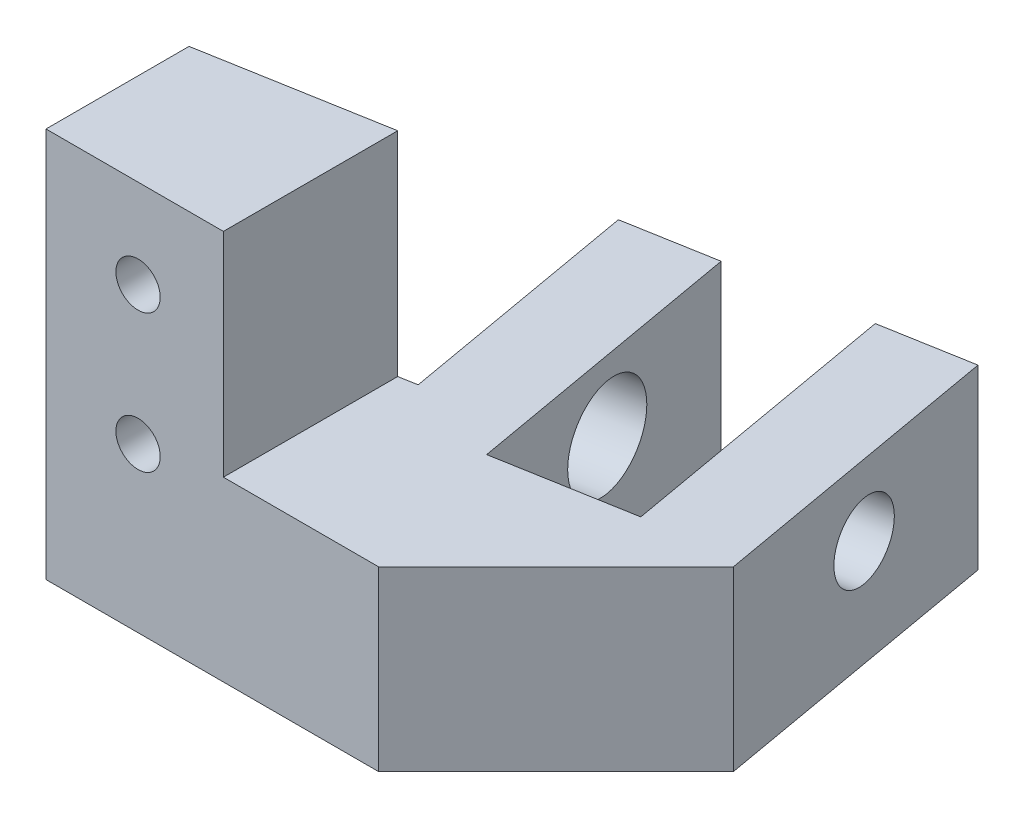
ISO-10303-21;
HEADER;
FILE_DESCRIPTION(('STEP AP214'),'2;1');
FILE_NAME('part.step','',(''),(''),'','','');
FILE_SCHEMA(('AUTOMOTIVE_DESIGN { 1 0 10303 214 1 1 1 1 }'));
ENDSEC;
DATA;
#1=APPLICATION_CONTEXT('core data for automotive mechanical design processes');
#2=APPLICATION_PROTOCOL_DEFINITION('international standard','automotive_design',2000,#1);
#3=PRODUCT_CONTEXT('',#1,'mechanical');
#4=PRODUCT('Part','Part','',(#3));
#5=PRODUCT_RELATED_PRODUCT_CATEGORY('part','',(#4));
#6=PRODUCT_DEFINITION_FORMATION('','',#4);
#7=PRODUCT_DEFINITION_CONTEXT('part definition',#1,'design');
#8=PRODUCT_DEFINITION('design','',#6,#7);
#9=PRODUCT_DEFINITION_SHAPE('','',#8);
#10=(LENGTH_UNIT() NAMED_UNIT(*) SI_UNIT(.MILLI.,.METRE.));
#11=(NAMED_UNIT(*) PLANE_ANGLE_UNIT() SI_UNIT($,.RADIAN.));
#12=(NAMED_UNIT(*) SI_UNIT($,.STERADIAN.) SOLID_ANGLE_UNIT());
#13=UNCERTAINTY_MEASURE_WITH_UNIT(LENGTH_MEASURE(1.E-05),#10,'distance_accuracy_value','');
#14=(GEOMETRIC_REPRESENTATION_CONTEXT(3) GLOBAL_UNCERTAINTY_ASSIGNED_CONTEXT((#13)) GLOBAL_UNIT_ASSIGNED_CONTEXT((#10,
#11,#12)) REPRESENTATION_CONTEXT('',''));
#15=CARTESIAN_POINT('',(0.,0.,0.));
#16=DIRECTION('',(0.,0.,1.));
#17=DIRECTION('',(1.,0.,0.));
#18=AXIS2_PLACEMENT_3D('',#15,#16,#17);
#19=CARTESIAN_POINT('',(0.,22.,10.));
#20=DIRECTION('',(1.,0.,0.));
#21=DIRECTION('',(0.,0.,-1.));
#22=AXIS2_PLACEMENT_3D('',#19,#20,#21);
#23=PLANE('',#22);
#24=DIRECTION('',(0.,0.,-1.));
#25=VECTOR('',#24,1.);
#26=CARTESIAN_POINT('',(0.,22.,10.));
#27=LINE('',#26,#25);
#28=CARTESIAN_POINT('',(0.,22.,10.));
#29=VERTEX_POINT('',#28);
#30=CARTESIAN_POINT('',(0.,22.,1.93607629478369));
#31=VERTEX_POINT('',#30);
#32=EDGE_CURVE('E154',#29,#31,#27,.T.);
#33=ORIENTED_EDGE('',*,*,#32,.T.);
#34=DIRECTION('',(0.,1.,0.));
#35=VECTOR('',#34,1.);
#36=CARTESIAN_POINT('',(0.,-0.00100000000001141,1.93607629478369));
#37=LINE('',#36,#35);
#38=CARTESIAN_POINT('',(0.,0.,1.93607629478369));
#39=VERTEX_POINT('',#38);
#40=EDGE_CURVE('E135',#39,#31,#37,.T.);
#41=ORIENTED_EDGE('',*,*,#40,.F.);
#42=DIRECTION('',(0.,0.,-1.));
#43=VECTOR('',#42,1.);
#44=CARTESIAN_POINT('',(0.,0.,10.));
#45=LINE('',#44,#43);
#46=CARTESIAN_POINT('',(0.,0.,10.));
#47=VERTEX_POINT('',#46);
#48=EDGE_CURVE('E156',#47,#39,#45,.T.);
#49=ORIENTED_EDGE('',*,*,#48,.F.);
#50=DIRECTION('',(0.,-1.,0.));
#51=VECTOR('',#50,1.);
#52=CARTESIAN_POINT('',(0.,22.,10.));
#53=LINE('',#52,#51);
#54=EDGE_CURVE('E184',#29,#47,#53,.T.);
#55=ORIENTED_EDGE('',*,*,#54,.F.);
#56=EDGE_LOOP('',(#33,#41,#49,#55));
#57=FACE_BOUND('',#56,.T.);
#58=ADVANCED_FACE('F36',(#57),#23,.F.);
#59=CARTESIAN_POINT('',(0.,0.,10.));
#60=DIRECTION('',(0.,1.,0.));
#61=DIRECTION('',(0.,0.,1.));
#62=AXIS2_PLACEMENT_3D('',#59,#60,#61);
#63=PLANE('',#62);
#64=ORIENTED_EDGE('',*,*,#48,.T.);
#65=DIRECTION('',(-0.984807753012208,0.,0.173648177666931));
#66=VECTOR('',#65,1.);
#67=CARTESIAN_POINT('',(10.9800342919995,0.,0.));
#68=LINE('',#67,#66);
#69=CARTESIAN_POINT('',(10.9800342919995,0.,0.));
#70=VERTEX_POINT('',#69);
#71=EDGE_CURVE('E248',#70,#39,#68,.T.);
#72=ORIENTED_EDGE('',*,*,#71,.F.);
#73=DIRECTION('',(-0.173648177666931,0.,-0.984807753012208));
#74=VECTOR('',#73,1.);
#75=CARTESIAN_POINT('',(8.56384530194855,0.,-13.7028886920363));
#76=LINE('',#75,#74);
#77=CARTESIAN_POINT('',(8.56384530194855,0.,-13.7028886920363));
#78=VERTEX_POINT('',#77);
#79=EDGE_CURVE('E207',#70,#78,#76,.T.);
#80=ORIENTED_EDGE('',*,*,#79,.T.);
#81=DIRECTION('',(0.984807753012208,0.,-0.173648177666931));
#82=VECTOR('',#81,1.);
#83=CARTESIAN_POINT('',(13.4878840670096,0.,-14.5711295803709));
#84=LINE('',#83,#82);
#85=CARTESIAN_POINT('',(13.4878840670096,0.,-14.5711295803709));
#86=VERTEX_POINT('',#85);
#87=EDGE_CURVE('E216',#78,#86,#84,.T.);
#88=ORIENTED_EDGE('',*,*,#87,.T.);
#89=DIRECTION('',(0.17364817766693,0.,0.984807753012208));
#90=VECTOR('',#89,1.);
#91=CARTESIAN_POINT('',(16.0571673514282,0.,0.));
#92=LINE('',#91,#90);
#93=CARTESIAN_POINT('',(16.3176396179286,0.,1.47721162951831));
#94=VERTEX_POINT('',#93);
#95=EDGE_CURVE('E182',#86,#94,#92,.T.);
#96=ORIENTED_EDGE('',*,*,#95,.T.);
#97=DIRECTION('',(-0.984807753012208,0.,0.173648177666931));
#98=VECTOR('',#97,1.);
#99=CARTESIAN_POINT('',(16.3176396179286,0.,1.47721162951831));
#100=LINE('',#99,#98);
#101=CARTESIAN_POINT('',(23.7036977655202,0.,0.174850297016331));
#102=VERTEX_POINT('',#101);
#103=EDGE_CURVE('E235',#102,#94,#100,.T.);
#104=ORIENTED_EDGE('',*,*,#103,.F.);
#105=DIRECTION('',(-0.173648177666931,0.,-0.984807753012208));
#106=VECTOR('',#105,1.);
#107=CARTESIAN_POINT('',(20.8739422146012,0.,-15.8734909128729));
#108=LINE('',#107,#106);
#109=CARTESIAN_POINT('',(20.8739422146011,0.,-15.8734909128729));
#110=VERTEX_POINT('',#109);
#111=EDGE_CURVE('E189',#102,#110,#108,.T.);
#112=ORIENTED_EDGE('',*,*,#111,.T.);
#113=DIRECTION('',(0.984807753012208,0.,-0.17364817766693));
#114=VECTOR('',#113,1.);
#115=CARTESIAN_POINT('',(25.7979809796622,0.,-16.7417318012075));
#116=LINE('',#115,#114);
#117=CARTESIAN_POINT('',(25.7979809796622,0.,-16.7417318012075));
#118=VERTEX_POINT('',#117);
#119=EDGE_CURVE('E201',#110,#118,#116,.T.);
#120=ORIENTED_EDGE('',*,*,#119,.T.);
#121=DIRECTION('',(0.17364817766693,0.,0.984807753012208));
#122=VECTOR('',#121,1.);
#123=CARTESIAN_POINT('',(28.75,0.,0.));
#124=LINE('',#123,#122);
#125=CARTESIAN_POINT('',(28.75,0.,0.));
#126=VERTEX_POINT('',#125);
#127=EDGE_CURVE('E185',#118,#126,#124,.T.);
#128=ORIENTED_EDGE('',*,*,#127,.T.);
#129=DIRECTION('',(-0.707106781186546,0.,0.707106781186549));
#130=VECTOR('',#129,1.);
#131=CARTESIAN_POINT('',(18.75,0.,10.));
#132=LINE('',#131,#130);
#133=CARTESIAN_POINT('',(18.75,0.,10.));
#134=VERTEX_POINT('',#133);
#135=EDGE_CURVE('E11',#126,#134,#132,.T.);
#136=ORIENTED_EDGE('',*,*,#135,.T.);
#137=DIRECTION('',(1.,0.,0.));
#138=VECTOR('',#137,1.);
#139=CARTESIAN_POINT('',(0.,0.,10.));
#140=LINE('',#139,#138);
#141=EDGE_CURVE('E187',#47,#134,#140,.T.);
#142=ORIENTED_EDGE('',*,*,#141,.F.);
#143=EDGE_LOOP('',(#64,#72,#80,#88,#96,#104,#112,#120,#128,#136,#142));
#144=FACE_BOUND('',#143,.T.);
#145=ADVANCED_FACE('F279',(#144),#63,.F.);
#146=CARTESIAN_POINT('',(28.75,10.,10.));
#147=DIRECTION('',(0.,-1.,0.));
#148=DIRECTION('',(1.,0.,0.));
#149=AXIS2_PLACEMENT_3D('',#146,#147,#148);
#150=PLANE('',#149);
#151=DIRECTION('',(0.173648177666931,0.,0.984807753012208));
#152=VECTOR('',#151,1.);
#153=CARTESIAN_POINT('',(8.56384530194855,10.,-13.7028886920363));
#154=LINE('',#153,#152);
#155=CARTESIAN_POINT('',(8.56384530194855,10.,-13.7028886920363));
#156=VERTEX_POINT('',#155);
#157=CARTESIAN_POINT('',(10.9800342919995,10.,0.));
#158=VERTEX_POINT('',#157);
#159=EDGE_CURVE('E211',#156,#158,#154,.T.);
#160=ORIENTED_EDGE('',*,*,#159,.T.);
#161=DIRECTION('',(0.984807753012208,0.,-0.173648177666931));
#162=VECTOR('',#161,1.);
#163=CARTESIAN_POINT('',(10.9800342919995,10.,0.));
#164=LINE('',#163,#162);
#165=CARTESIAN_POINT('',(10.,10.,0.172806487699028));
#166=VERTEX_POINT('',#165);
#167=EDGE_CURVE('E252',#166,#158,#164,.T.);
#168=ORIENTED_EDGE('',*,*,#167,.F.);
#169=DIRECTION('',(0.,0.,-1.));
#170=VECTOR('',#169,1.);
#171=CARTESIAN_POINT('',(10.,10.,10.));
#172=LINE('',#171,#170);
#173=CARTESIAN_POINT('',(10.,10.,10.));
#174=VERTEX_POINT('',#173);
#175=EDGE_CURVE('E149',#174,#166,#172,.T.);
#176=ORIENTED_EDGE('',*,*,#175,.F.);
#177=DIRECTION('',(-1.,0.,0.));
#178=VECTOR('',#177,1.);
#179=CARTESIAN_POINT('',(28.75,10.,10.));
#180=LINE('',#179,#178);
#181=CARTESIAN_POINT('',(18.75,10.,10.));
#182=VERTEX_POINT('',#181);
#183=EDGE_CURVE('E172',#182,#174,#180,.T.);
#184=ORIENTED_EDGE('',*,*,#183,.F.);
#185=DIRECTION('',(0.707106781186546,0.,-0.707106781186549));
#186=VECTOR('',#185,1.);
#187=CARTESIAN_POINT('',(18.75,10.,10.));
#188=LINE('',#187,#186);
#189=CARTESIAN_POINT('',(28.75,10.,0.));
#190=VERTEX_POINT('',#189);
#191=EDGE_CURVE('E45',#182,#190,#188,.T.);
#192=ORIENTED_EDGE('',*,*,#191,.T.);
#193=DIRECTION('',(-0.17364817766693,0.,-0.984807753012208));
#194=VECTOR('',#193,1.);
#195=CARTESIAN_POINT('',(28.75,10.,0.));
#196=LINE('',#195,#194);
#197=CARTESIAN_POINT('',(25.7979809796622,10.,-16.7417318012075));
#198=VERTEX_POINT('',#197);
#199=EDGE_CURVE('E171',#190,#198,#196,.T.);
#200=ORIENTED_EDGE('',*,*,#199,.T.);
#201=DIRECTION('',(-0.984807753012208,0.,0.17364817766693));
#202=VECTOR('',#201,1.);
#203=CARTESIAN_POINT('',(25.7979809796622,10.,-16.7417318012075));
#204=LINE('',#203,#202);
#205=CARTESIAN_POINT('',(20.8739422146011,10.,-15.8734909128729));
#206=VERTEX_POINT('',#205);
#207=EDGE_CURVE('E181',#198,#206,#204,.T.);
#208=ORIENTED_EDGE('',*,*,#207,.T.);
#209=DIRECTION('',(0.173648177666931,0.,0.984807753012208));
#210=VECTOR('',#209,1.);
#211=CARTESIAN_POINT('',(20.8739422146011,10.,-15.8734909128729));
#212=LINE('',#211,#210);
#213=CARTESIAN_POINT('',(23.7036977655202,10.,0.174850297016331));
#214=VERTEX_POINT('',#213);
#215=EDGE_CURVE('E199',#206,#214,#212,.T.);
#216=ORIENTED_EDGE('',*,*,#215,.T.);
#217=DIRECTION('',(0.984807753012208,0.,-0.173648177666931));
#218=VECTOR('',#217,1.);
#219=CARTESIAN_POINT('',(16.3176396179286,10.,1.47721162951831));
#220=LINE('',#219,#218);
#221=CARTESIAN_POINT('',(16.3176396179286,10.,1.47721162951831));
#222=VERTEX_POINT('',#221);
#223=EDGE_CURVE('E230',#222,#214,#220,.T.);
#224=ORIENTED_EDGE('',*,*,#223,.F.);
#225=DIRECTION('',(-0.17364817766693,0.,-0.984807753012208));
#226=VECTOR('',#225,1.);
#227=CARTESIAN_POINT('',(16.0571673514282,10.,0.));
#228=LINE('',#227,#226);
#229=CARTESIAN_POINT('',(13.4878840670096,10.,-14.5711295803709));
#230=VERTEX_POINT('',#229);
#231=EDGE_CURVE('E221',#222,#230,#228,.T.);
#232=ORIENTED_EDGE('',*,*,#231,.T.);
#233=DIRECTION('',(-0.984807753012208,0.,0.173648177666931));
#234=VECTOR('',#233,1.);
#235=CARTESIAN_POINT('',(13.4878840670096,10.,-14.5711295803709));
#236=LINE('',#235,#234);
#237=EDGE_CURVE('E218',#230,#156,#236,.T.);
#238=ORIENTED_EDGE('',*,*,#237,.T.);
#239=EDGE_LOOP('',(#160,#168,#176,#184,#192,#200,#208,#216,#224,#232,#238));
#240=FACE_BOUND('',#239,.T.);
#241=ADVANCED_FACE('F169',(#240),#150,.F.);
#242=CARTESIAN_POINT('',(10.,10.,10.));
#243=DIRECTION('',(-1.,0.,0.));
#244=DIRECTION('',(0.,0.,1.));
#245=AXIS2_PLACEMENT_3D('',#242,#243,#244);
#246=PLANE('',#245);
#247=ORIENTED_EDGE('',*,*,#175,.T.);
#248=DIRECTION('',(0.,-1.,0.));
#249=VECTOR('',#248,1.);
#250=CARTESIAN_POINT('',(10.,-0.00100000000000793,0.172806487699029));
#251=LINE('',#250,#249);
#252=CARTESIAN_POINT('',(10.,22.,0.172806487699028));
#253=VERTEX_POINT('',#252);
#254=EDGE_CURVE('E132',#253,#166,#251,.T.);
#255=ORIENTED_EDGE('',*,*,#254,.F.);
#256=DIRECTION('',(0.,0.,-1.));
#257=VECTOR('',#256,1.);
#258=CARTESIAN_POINT('',(10.,22.,10.));
#259=LINE('',#258,#257);
#260=CARTESIAN_POINT('',(10.,22.,10.));
#261=VERTEX_POINT('',#260);
#262=EDGE_CURVE('E146',#261,#253,#259,.T.);
#263=ORIENTED_EDGE('',*,*,#262,.F.);
#264=DIRECTION('',(0.,1.,0.));
#265=VECTOR('',#264,1.);
#266=CARTESIAN_POINT('',(10.,10.,10.));
#267=LINE('',#266,#265);
#268=EDGE_CURVE('E193',#174,#261,#267,.T.);
#269=ORIENTED_EDGE('',*,*,#268,.F.);
#270=EDGE_LOOP('',(#247,#255,#263,#269));
#271=FACE_BOUND('',#270,.T.);
#272=ADVANCED_FACE('F144',(#271),#246,.F.);
#273=CARTESIAN_POINT('',(10.,22.,10.));
#274=DIRECTION('',(0.,-1.,0.));
#275=DIRECTION('',(1.,0.,0.));
#276=AXIS2_PLACEMENT_3D('',#273,#274,#275);
#277=PLANE('',#276);
#278=ORIENTED_EDGE('',*,*,#262,.T.);
#279=DIRECTION('',(0.984807753012208,0.,-0.173648177666931));
#280=VECTOR('',#279,1.);
#281=CARTESIAN_POINT('',(10.9800342919995,22.,0.));
#282=LINE('',#281,#280);
#283=EDGE_CURVE('E129',#31,#253,#282,.T.);
#284=ORIENTED_EDGE('',*,*,#283,.F.);
#285=ORIENTED_EDGE('',*,*,#32,.F.);
#286=DIRECTION('',(-1.,0.,0.));
#287=VECTOR('',#286,1.);
#288=CARTESIAN_POINT('',(10.,22.,10.));
#289=LINE('',#288,#287);
#290=EDGE_CURVE('E153',#261,#29,#289,.T.);
#291=ORIENTED_EDGE('',*,*,#290,.F.);
#292=EDGE_LOOP('',(#278,#284,#285,#291));
#293=FACE_BOUND('',#292,.T.);
#294=ADVANCED_FACE('F152',(#293),#277,.F.);
#295=CARTESIAN_POINT('',(0.,0.,10.));
#296=DIRECTION('',(0.,0.,1.));
#297=DIRECTION('',(1.,0.,0.));
#298=AXIS2_PLACEMENT_3D('',#295,#296,#297);
#299=PLANE('',#298);
#300=CARTESIAN_POINT('',(5.19,17.,10.));
#301=DIRECTION('',(0.,0.,1.));
#302=DIRECTION('',(1.,0.,0.));
#303=AXIS2_PLACEMENT_3D('',#300,#301,#302);
#304=CIRCLE('',#303,1.25);
#305=CARTESIAN_POINT('',(6.44,17.,10.));
#306=VERTEX_POINT('',#305);
#307=EDGE_CURVE('E258',#306,#306,#304,.T.);
#308=ORIENTED_EDGE('',*,*,#307,.F.);
#309=EDGE_LOOP('',(#308));
#310=FACE_BOUND('',#309,.T.);
#311=CARTESIAN_POINT('',(5.19,9.22,10.));
#312=DIRECTION('',(0.,0.,1.));
#313=DIRECTION('',(1.,0.,0.));
#314=AXIS2_PLACEMENT_3D('',#311,#312,#313);
#315=CIRCLE('',#314,1.25);
#316=CARTESIAN_POINT('',(6.44,9.22,10.));
#317=VERTEX_POINT('',#316);
#318=EDGE_CURVE('E259',#317,#317,#315,.T.);
#319=ORIENTED_EDGE('',*,*,#318,.F.);
#320=EDGE_LOOP('',(#319));
#321=FACE_BOUND('',#320,.T.);
#322=ORIENTED_EDGE('',*,*,#141,.T.);
#323=DIRECTION('',(0.,1.,0.));
#324=VECTOR('',#323,1.);
#325=CARTESIAN_POINT('',(18.75,10.,10.));
#326=LINE('',#325,#324);
#327=EDGE_CURVE('E163',#134,#182,#326,.T.);
#328=ORIENTED_EDGE('',*,*,#327,.T.);
#329=ORIENTED_EDGE('',*,*,#183,.T.);
#330=ORIENTED_EDGE('',*,*,#268,.T.);
#331=ORIENTED_EDGE('',*,*,#290,.T.);
#332=ORIENTED_EDGE('',*,*,#54,.T.);
#333=EDGE_LOOP('',(#322,#328,#329,#330,#331,#332));
#334=FACE_BOUND('',#333,.T.);
#335=ADVANCED_FACE('F270',(#310,#321,#334),#299,.T.);
#336=CARTESIAN_POINT('',(20.8739422146012,-18.5018342318405,-15.8734909128729));
#337=DIRECTION('',(-0.984807753012208,0.,0.173648177666931));
#338=DIRECTION('',(0.173648177666931,0.,0.984807753012208));
#339=AXIS2_PLACEMENT_3D('',#336,#337,#338);
#340=PLANE('',#339);
#341=CARTESIAN_POINT('',(22.2482421386505,6.,-8.07944873890988));
#342=DIRECTION('',(-0.984807753012208,0.,0.173648177666931));
#343=DIRECTION('',(0.173648177666931,0.,0.984807753012208));
#344=AXIS2_PLACEMENT_3D('',#341,#342,#343);
#345=CIRCLE('',#344,2.1);
#346=CARTESIAN_POINT('',(22.612903311751,6.,-6.01135245758424));
#347=VERTEX_POINT('',#346);
#348=EDGE_CURVE('E242',#347,#347,#345,.T.);
#349=ORIENTED_EDGE('',*,*,#348,.F.);
#350=EDGE_LOOP('',(#349));
#351=FACE_BOUND('',#350,.T.);
#352=ORIENTED_EDGE('',*,*,#111,.F.);
#353=DIRECTION('',(0.,1.,0.));
#354=VECTOR('',#353,1.);
#355=CARTESIAN_POINT('',(23.7036977655202,-0.001000000000001,0.174850297016331));
#356=LINE('',#355,#354);
#357=EDGE_CURVE('E224',#102,#214,#356,.T.);
#358=ORIENTED_EDGE('',*,*,#357,.T.);
#359=ORIENTED_EDGE('',*,*,#215,.F.);
#360=DIRECTION('',(0.,1.,0.));
#361=VECTOR('',#360,1.);
#362=CARTESIAN_POINT('',(20.8739422146012,-18.5018342318405,-15.8734909128729));
#363=LINE('',#362,#361);
#364=EDGE_CURVE('E198',#110,#206,#363,.T.);
#365=ORIENTED_EDGE('',*,*,#364,.F.);
#366=EDGE_LOOP('',(#352,#358,#359,#365));
#367=FACE_BOUND('',#366,.T.);
#368=ADVANCED_FACE('F273',(#351,#367),#340,.T.);
#369=CARTESIAN_POINT('',(25.7979809796622,-18.5018342318405,-16.7417318012075));
#370=DIRECTION('',(-0.17364817766693,0.,-0.984807753012208));
#371=DIRECTION('',(-0.984807753012208,0.,0.17364817766693));
#372=AXIS2_PLACEMENT_3D('',#369,#370,#371);
#373=PLANE('',#372);
#374=ORIENTED_EDGE('',*,*,#119,.F.);
#375=ORIENTED_EDGE('',*,*,#364,.T.);
#376=ORIENTED_EDGE('',*,*,#207,.F.);
#377=DIRECTION('',(0.,1.,0.));
#378=VECTOR('',#377,1.);
#379=CARTESIAN_POINT('',(25.7979809796622,-18.5018342318405,-16.7417318012075));
#380=LINE('',#379,#378);
#381=EDGE_CURVE('E179',#118,#198,#380,.T.);
#382=ORIENTED_EDGE('',*,*,#381,.F.);
#383=EDGE_LOOP('',(#374,#375,#376,#382));
#384=FACE_BOUND('',#383,.T.);
#385=ADVANCED_FACE('F298',(#384),#373,.T.);
#386=CARTESIAN_POINT('',(28.75,-18.5018342318405,0.));
#387=DIRECTION('',(0.984807753012208,0.,-0.17364817766693));
#388=DIRECTION('',(-0.17364817766693,0.,-0.984807753012208));
#389=AXIS2_PLACEMENT_3D('',#386,#387,#388);
#390=PLANE('',#389);
#391=CARTESIAN_POINT('',(27.1722809037115,6.,-8.94768962724453));
#392=DIRECTION('',(0.984807753012208,0.,-0.17364817766693));
#393=DIRECTION('',(-0.17364817766693,0.,-0.984807753012208));
#394=AXIS2_PLACEMENT_3D('',#391,#392,#393);
#395=CIRCLE('',#394,2.1);
#396=CARTESIAN_POINT('',(26.807619730611,6.,-11.0157859085702));
#397=VERTEX_POINT('',#396);
#398=EDGE_CURVE('E245',#397,#397,#395,.F.);
#399=ORIENTED_EDGE('',*,*,#398,.T.);
#400=EDGE_LOOP('',(#399));
#401=FACE_BOUND('',#400,.T.);
#402=ORIENTED_EDGE('',*,*,#127,.F.);
#403=ORIENTED_EDGE('',*,*,#381,.T.);
#404=ORIENTED_EDGE('',*,*,#199,.F.);
#405=DIRECTION('',(0.,1.,0.));
#406=VECTOR('',#405,1.);
#407=CARTESIAN_POINT('',(28.75,0.,0.));
#408=LINE('',#407,#406);
#409=EDGE_CURVE('E177',#126,#190,#408,.T.);
#410=ORIENTED_EDGE('',*,*,#409,.F.);
#411=EDGE_LOOP('',(#402,#403,#404,#410));
#412=FACE_BOUND('',#411,.T.);
#413=ADVANCED_FACE('F176',(#401,#412),#390,.T.);
#414=CARTESIAN_POINT('',(8.56384530194856,-18.5018342318405,-13.7028886920363));
#415=DIRECTION('',(-0.984807753012208,0.,0.173648177666931));
#416=DIRECTION('',(0.173648177666931,0.,0.984807753012208));
#417=AXIS2_PLACEMENT_3D('',#414,#415,#416);
#418=PLANE('',#417);
#419=CARTESIAN_POINT('',(9.93814522599789,6.,-5.90884651807325));
#420=DIRECTION('',(-0.984807753012208,0.,0.173648177666931));
#421=DIRECTION('',(0.173648177666931,0.,0.984807753012208));
#422=AXIS2_PLACEMENT_3D('',#419,#420,#421);
#423=CIRCLE('',#422,2.75);
#424=CARTESIAN_POINT('',(10.415677714582,6.,-3.20062519728968));
#425=VERTEX_POINT('',#424);
#426=EDGE_CURVE('E238',#425,#425,#423,.T.);
#427=ORIENTED_EDGE('',*,*,#426,.F.);
#428=EDGE_LOOP('',(#427));
#429=FACE_BOUND('',#428,.T.);
#430=ORIENTED_EDGE('',*,*,#79,.F.);
#431=DIRECTION('',(0.,1.,0.));
#432=VECTOR('',#431,1.);
#433=CARTESIAN_POINT('',(10.9800342919995,-18.5018342318405,0.));
#434=LINE('',#433,#432);
#435=EDGE_CURVE('E213',#70,#158,#434,.T.);
#436=ORIENTED_EDGE('',*,*,#435,.T.);
#437=ORIENTED_EDGE('',*,*,#159,.F.);
#438=DIRECTION('',(0.,1.,0.));
#439=VECTOR('',#438,1.);
#440=CARTESIAN_POINT('',(8.56384530194856,-18.5018342318405,-13.7028886920363));
#441=LINE('',#440,#439);
#442=EDGE_CURVE('E210',#78,#156,#441,.T.);
#443=ORIENTED_EDGE('',*,*,#442,.F.);
#444=EDGE_LOOP('',(#430,#436,#437,#443));
#445=FACE_BOUND('',#444,.T.);
#446=ADVANCED_FACE('F297',(#429,#445),#418,.T.);
#447=CARTESIAN_POINT('',(13.4878840670096,-18.5018342318405,-14.5711295803709));
#448=DIRECTION('',(-0.173648177666931,0.,-0.984807753012208));
#449=DIRECTION('',(-0.984807753012208,0.,0.173648177666931));
#450=AXIS2_PLACEMENT_3D('',#447,#448,#449);
#451=PLANE('',#450);
#452=ORIENTED_EDGE('',*,*,#87,.F.);
#453=ORIENTED_EDGE('',*,*,#442,.T.);
#454=ORIENTED_EDGE('',*,*,#237,.F.);
#455=DIRECTION('',(0.,1.,0.));
#456=VECTOR('',#455,1.);
#457=CARTESIAN_POINT('',(13.4878840670096,-18.5018342318405,-14.5711295803709));
#458=LINE('',#457,#456);
#459=EDGE_CURVE('E208',#86,#230,#458,.T.);
#460=ORIENTED_EDGE('',*,*,#459,.F.);
#461=EDGE_LOOP('',(#452,#453,#454,#460));
#462=FACE_BOUND('',#461,.T.);
#463=ADVANCED_FACE('F310',(#462),#451,.T.);
#464=CARTESIAN_POINT('',(16.0571673514282,-18.5018342318405,0.));
#465=DIRECTION('',(0.984807753012208,0.,-0.17364817766693));
#466=DIRECTION('',(-0.17364817766693,0.,-0.984807753012208));
#467=AXIS2_PLACEMENT_3D('',#464,#465,#466);
#468=PLANE('',#467);
#469=CARTESIAN_POINT('',(14.8621839910589,6.,-6.7770874064079));
#470=DIRECTION('',(0.984807753012208,0.,-0.17364817766693));
#471=DIRECTION('',(-0.17364817766693,0.,-0.984807753012208));
#472=AXIS2_PLACEMENT_3D('',#469,#470,#471);
#473=CIRCLE('',#472,2.75);
#474=CARTESIAN_POINT('',(14.3846515024749,6.,-9.48530872719147));
#475=VERTEX_POINT('',#474);
#476=EDGE_CURVE('E239',#475,#475,#473,.F.);
#477=ORIENTED_EDGE('',*,*,#476,.T.);
#478=EDGE_LOOP('',(#477));
#479=FACE_BOUND('',#478,.T.);
#480=ORIENTED_EDGE('',*,*,#95,.F.);
#481=ORIENTED_EDGE('',*,*,#459,.T.);
#482=ORIENTED_EDGE('',*,*,#231,.F.);
#483=DIRECTION('',(0.,1.,0.));
#484=VECTOR('',#483,1.);
#485=CARTESIAN_POINT('',(16.3176396179286,-0.00100000000000273,1.47721162951831));
#486=LINE('',#485,#484);
#487=EDGE_CURVE('E227',#94,#222,#486,.T.);
#488=ORIENTED_EDGE('',*,*,#487,.F.);
#489=EDGE_LOOP('',(#480,#481,#482,#488));
#490=FACE_BOUND('',#489,.T.);
#491=ADVANCED_FACE('F306',(#479,#490),#468,.T.);
#492=CARTESIAN_POINT('',(16.3176396179286,-0.00100000000000273,1.47721162951831));
#493=DIRECTION('',(0.173648177666931,0.,0.984807753012208));
#494=DIRECTION('',(0.984807753012208,0.,-0.173648177666931));
#495=AXIS2_PLACEMENT_3D('',#492,#493,#494);
#496=PLANE('',#495);
#497=ORIENTED_EDGE('',*,*,#103,.T.);
#498=ORIENTED_EDGE('',*,*,#487,.T.);
#499=ORIENTED_EDGE('',*,*,#223,.T.);
#500=ORIENTED_EDGE('',*,*,#357,.F.);
#501=EDGE_LOOP('',(#497,#498,#499,#500));
#502=FACE_BOUND('',#501,.T.);
#503=ADVANCED_FACE('F309',(#502),#496,.F.);
#504=CARTESIAN_POINT('',(30.036426515178,6.,-9.45271577522383));
#505=DIRECTION('',(-0.984807753012208,0.,0.173648177666931));
#506=DIRECTION('',(0.173648177666931,0.,0.984807753012208));
#507=AXIS2_PLACEMENT_3D('',#504,#505,#506);
#508=CYLINDRICAL_SURFACE('',#507,2.75);
#509=ORIENTED_EDGE('',*,*,#476,.F.);
#510=EDGE_LOOP('',(#509));
#511=FACE_BOUND('',#510,.T.);
#512=ORIENTED_EDGE('',*,*,#426,.T.);
#513=EDGE_LOOP('',(#512));
#514=FACE_BOUND('',#513,.T.);
#515=ADVANCED_FACE('F320',(#511,#514),#508,.F.);
#516=CARTESIAN_POINT('',(30.036426515178,6.,-9.45271577522382));
#517=DIRECTION('',(-0.984807753012208,0.,0.173648177666931));
#518=DIRECTION('',(0.173648177666931,0.,0.984807753012208));
#519=AXIS2_PLACEMENT_3D('',#516,#517,#518);
#520=CYLINDRICAL_SURFACE('',#519,2.1);
#521=ORIENTED_EDGE('',*,*,#398,.F.);
#522=EDGE_LOOP('',(#521));
#523=FACE_BOUND('',#522,.T.);
#524=ORIENTED_EDGE('',*,*,#348,.T.);
#525=EDGE_LOOP('',(#524));
#526=FACE_BOUND('',#525,.T.);
#527=ADVANCED_FACE('F324',(#523,#526),#520,.F.);
#528=CARTESIAN_POINT('',(18.75,0.,10.));
#529=DIRECTION('',(0.707106781186549,0.,0.707106781186546));
#530=DIRECTION('',(0.,-1.,0.));
#531=AXIS2_PLACEMENT_3D('',#528,#529,#530);
#532=PLANE('',#531);
#533=ORIENTED_EDGE('',*,*,#135,.F.);
#534=ORIENTED_EDGE('',*,*,#409,.T.);
#535=ORIENTED_EDGE('',*,*,#191,.F.);
#536=ORIENTED_EDGE('',*,*,#327,.F.);
#537=EDGE_LOOP('',(#533,#534,#535,#536));
#538=FACE_BOUND('',#537,.T.);
#539=ADVANCED_FACE('F39',(#538),#532,.T.);
#540=CARTESIAN_POINT('',(10.9800342919995,-0.00100000000000794,0.));
#541=DIRECTION('',(0.173648177666931,0.,0.984807753012208));
#542=DIRECTION('',(0.984807753012208,0.,-0.173648177666931));
#543=AXIS2_PLACEMENT_3D('',#540,#541,#542);
#544=PLANE('',#543);
#545=CARTESIAN_POINT('',(5.19,17.,1.02093926490675));
#546=DIRECTION('',(0.173648177666931,0.,0.984807753012208));
#547=DIRECTION('',(-0.984807753012208,0.,0.173648177666931));
#548=AXIS2_PLACEMENT_3D('',#545,#546,#547);
#549=ELLIPSE('',#548,1.26928326485718,1.25);
#550=CARTESIAN_POINT('',(3.94,17.,1.24134799079233));
#551=VERTEX_POINT('',#550);
#552=EDGE_CURVE('E150',#551,#551,#549,.F.);
#553=ORIENTED_EDGE('',*,*,#552,.F.);
#554=EDGE_LOOP('',(#553));
#555=FACE_BOUND('',#554,.T.);
#556=CARTESIAN_POINT('',(5.19,9.22,1.02093926490675));
#557=DIRECTION('',(0.173648177666931,0.,0.984807753012208));
#558=DIRECTION('',(-0.984807753012208,0.,0.173648177666931));
#559=AXIS2_PLACEMENT_3D('',#556,#557,#558);
#560=ELLIPSE('',#559,1.26928326485718,1.25);
#561=CARTESIAN_POINT('',(3.94,9.22,1.24134799079233));
#562=VERTEX_POINT('',#561);
#563=EDGE_CURVE('E255',#562,#562,#560,.F.);
#564=ORIENTED_EDGE('',*,*,#563,.F.);
#565=EDGE_LOOP('',(#564));
#566=FACE_BOUND('',#565,.T.);
#567=ORIENTED_EDGE('',*,*,#71,.T.);
#568=ORIENTED_EDGE('',*,*,#40,.T.);
#569=ORIENTED_EDGE('',*,*,#283,.T.);
#570=ORIENTED_EDGE('',*,*,#254,.T.);
#571=ORIENTED_EDGE('',*,*,#167,.T.);
#572=ORIENTED_EDGE('',*,*,#435,.F.);
#573=EDGE_LOOP('',(#567,#568,#569,#570,#571,#572));
#574=FACE_BOUND('',#573,.T.);
#575=ADVANCED_FACE('F131',(#555,#566,#574),#544,.F.);
#576=CARTESIAN_POINT('',(5.19,9.22,-16.7427318012075));
#577=DIRECTION('',(0.,0.,1.));
#578=DIRECTION('',(1.,0.,0.));
#579=AXIS2_PLACEMENT_3D('',#576,#577,#578);
#580=CYLINDRICAL_SURFACE('',#579,1.25);
#581=ORIENTED_EDGE('',*,*,#318,.T.);
#582=EDGE_LOOP('',(#581));
#583=FACE_BOUND('',#582,.T.);
#584=ORIENTED_EDGE('',*,*,#563,.T.);
#585=EDGE_LOOP('',(#584));
#586=FACE_BOUND('',#585,.T.);
#587=ADVANCED_FACE('F331',(#583,#586),#580,.F.);
#588=CARTESIAN_POINT('',(5.19,17.,-16.7427318012075));
#589=DIRECTION('',(0.,0.,1.));
#590=DIRECTION('',(1.,0.,0.));
#591=AXIS2_PLACEMENT_3D('',#588,#589,#590);
#592=CYLINDRICAL_SURFACE('',#591,1.25);
#593=ORIENTED_EDGE('',*,*,#307,.T.);
#594=EDGE_LOOP('',(#593));
#595=FACE_BOUND('',#594,.T.);
#596=ORIENTED_EDGE('',*,*,#552,.T.);
#597=EDGE_LOOP('',(#596));
#598=FACE_BOUND('',#597,.T.);
#599=ADVANCED_FACE('F267',(#595,#598),#592,.F.);
#600=CLOSED_SHELL('',(#58,#145,#241,#272,#294,#335,#368,#385,#413,#446,#463,#491,#503,#515,#527,
#539,#575,#587,#599));
#601=MANIFOLD_SOLID_BREP('B2',#600);
#602=ADVANCED_BREP_SHAPE_REPRESENTATION('',(#18,#601),#14);
#603=SHAPE_DEFINITION_REPRESENTATION(#9,#602);
ENDSEC;
END-ISO-10303-21;
